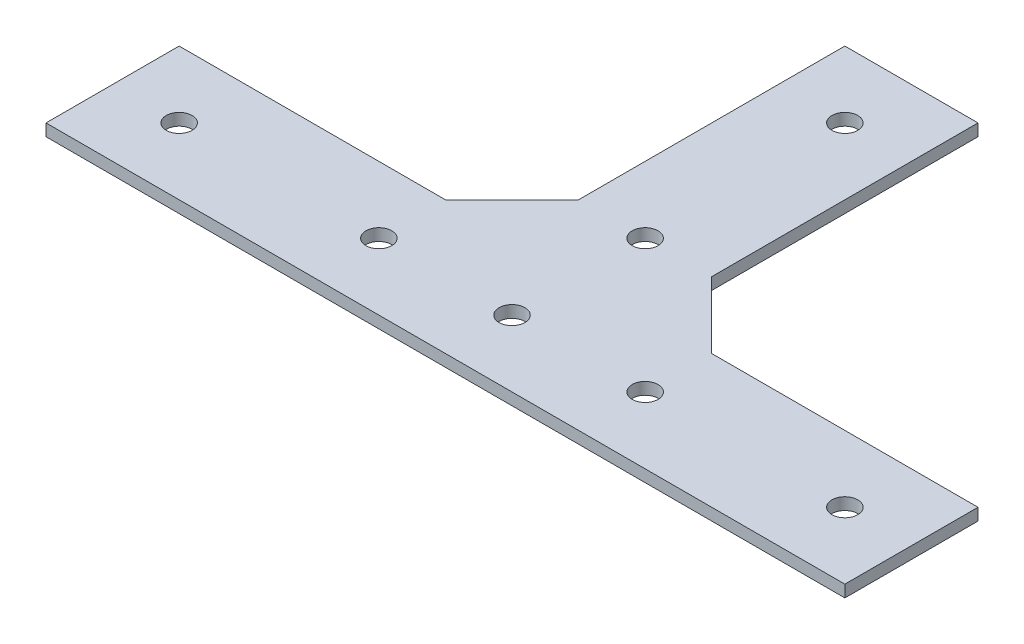
ISO-10303-21;
HEADER;
FILE_DESCRIPTION(('STEP AP214'),'2;1');
FILE_NAME('part.step','',(''),(''),'','','');
FILE_SCHEMA(('AUTOMOTIVE_DESIGN { 1 0 10303 214 1 1 1 1 }'));
ENDSEC;
DATA;
#1=APPLICATION_CONTEXT('core data for automotive mechanical design processes');
#2=APPLICATION_PROTOCOL_DEFINITION('international standard','automotive_design',2000,#1);
#3=PRODUCT_CONTEXT('',#1,'mechanical');
#4=PRODUCT('Part','Part','',(#3));
#5=PRODUCT_RELATED_PRODUCT_CATEGORY('part','',(#4));
#6=PRODUCT_DEFINITION_FORMATION('','',#4);
#7=PRODUCT_DEFINITION_CONTEXT('part definition',#1,'design');
#8=PRODUCT_DEFINITION('design','',#6,#7);
#9=PRODUCT_DEFINITION_SHAPE('','',#8);
#10=(LENGTH_UNIT() NAMED_UNIT(*) SI_UNIT(.MILLI.,.METRE.));
#11=(NAMED_UNIT(*) PLANE_ANGLE_UNIT() SI_UNIT($,.RADIAN.));
#12=(NAMED_UNIT(*) SI_UNIT($,.STERADIAN.) SOLID_ANGLE_UNIT());
#13=UNCERTAINTY_MEASURE_WITH_UNIT(LENGTH_MEASURE(1.E-05),#10,'distance_accuracy_value','');
#14=(GEOMETRIC_REPRESENTATION_CONTEXT(3) GLOBAL_UNCERTAINTY_ASSIGNED_CONTEXT((#13)) GLOBAL_UNIT_ASSIGNED_CONTEXT((#10,
#11,#12)) REPRESENTATION_CONTEXT('',''));
#15=CARTESIAN_POINT('',(0.,0.,0.));
#16=DIRECTION('',(0.,0.,1.));
#17=DIRECTION('',(1.,0.,0.));
#18=AXIS2_PLACEMENT_3D('',#15,#16,#17);
#19=CARTESIAN_POINT('',(0.,2.286,0.));
#20=DIRECTION('',(0.,1.,0.));
#21=DIRECTION('',(0.,0.,1.));
#22=AXIS2_PLACEMENT_3D('',#19,#20,#21);
#23=PLANE('',#22);
#24=DIRECTION('',(-0.707106781186548,0.,-0.707106781186548));
#25=VECTOR('',#24,1.);
#26=CARTESIAN_POINT('',(25.4,2.286,-38.1));
#27=LINE('',#26,#25);
#28=CARTESIAN_POINT('',(38.1,2.286,-25.4));
#29=VERTEX_POINT('',#28);
#30=CARTESIAN_POINT('',(25.4,2.286,-38.1));
#31=VERTEX_POINT('',#30);
#32=EDGE_CURVE('E157',#29,#31,#27,.T.);
#33=ORIENTED_EDGE('',*,*,#32,.T.);
#34=DIRECTION('',(0.,0.,-1.));
#35=VECTOR('',#34,1.);
#36=CARTESIAN_POINT('',(25.4,2.286,-38.1));
#37=LINE('',#36,#35);
#38=CARTESIAN_POINT('',(25.4,2.286,-88.9));
#39=VERTEX_POINT('',#38);
#40=EDGE_CURVE('E159',#31,#39,#37,.T.);
#41=ORIENTED_EDGE('',*,*,#40,.T.);
#42=DIRECTION('',(-1.,0.,0.));
#43=VECTOR('',#42,1.);
#44=CARTESIAN_POINT('',(0.,2.286,-88.9));
#45=LINE('',#44,#43);
#46=CARTESIAN_POINT('',(0.,2.286,-88.9));
#47=VERTEX_POINT('',#46);
#48=EDGE_CURVE('E161',#39,#47,#45,.T.);
#49=ORIENTED_EDGE('',*,*,#48,.T.);
#50=DIRECTION('',(0.,0.,1.));
#51=VECTOR('',#50,1.);
#52=CARTESIAN_POINT('',(0.,2.286,-88.9));
#53=LINE('',#52,#51);
#54=CARTESIAN_POINT('',(0.,2.286,-38.1));
#55=VERTEX_POINT('',#54);
#56=EDGE_CURVE('E129',#47,#55,#53,.T.);
#57=ORIENTED_EDGE('',*,*,#56,.T.);
#58=DIRECTION('',(0.707106781186548,0.,-0.707106781186548));
#59=VECTOR('',#58,1.);
#60=CARTESIAN_POINT('',(0.,2.286,-38.1));
#61=LINE('',#60,#59);
#62=CARTESIAN_POINT('',(-12.7,2.286,-25.4));
#63=VERTEX_POINT('',#62);
#64=EDGE_CURVE('E114',#63,#55,#61,.T.);
#65=ORIENTED_EDGE('',*,*,#64,.F.);
#66=DIRECTION('',(1.,0.,0.));
#67=VECTOR('',#66,1.);
#68=CARTESIAN_POINT('',(-12.7,2.286,-25.4));
#69=LINE('',#68,#67);
#70=CARTESIAN_POINT('',(-63.5,2.286,-25.4));
#71=VERTEX_POINT('',#70);
#72=EDGE_CURVE('E127',#71,#63,#69,.T.);
#73=ORIENTED_EDGE('',*,*,#72,.F.);
#74=DIRECTION('',(0.,0.,-1.));
#75=VECTOR('',#74,1.);
#76=CARTESIAN_POINT('',(-63.5,2.286,0.));
#77=LINE('',#76,#75);
#78=CARTESIAN_POINT('',(-63.5,2.286,0.));
#79=VERTEX_POINT('',#78);
#80=EDGE_CURVE('E133',#79,#71,#77,.T.);
#81=ORIENTED_EDGE('',*,*,#80,.F.);
#82=DIRECTION('',(1.,0.,0.));
#83=VECTOR('',#82,1.);
#84=CARTESIAN_POINT('',(0.,2.286,0.));
#85=LINE('',#84,#83);
#86=CARTESIAN_POINT('',(88.9,2.286,0.));
#87=VERTEX_POINT('',#86);
#88=EDGE_CURVE('E150',#79,#87,#85,.T.);
#89=ORIENTED_EDGE('',*,*,#88,.T.);
#90=DIRECTION('',(0.,0.,-1.));
#91=VECTOR('',#90,1.);
#92=CARTESIAN_POINT('',(88.9,2.286,0.));
#93=LINE('',#92,#91);
#94=CARTESIAN_POINT('',(88.9,2.286,-25.4));
#95=VERTEX_POINT('',#94);
#96=EDGE_CURVE('E153',#87,#95,#93,.T.);
#97=ORIENTED_EDGE('',*,*,#96,.T.);
#98=DIRECTION('',(-1.,0.,0.));
#99=VECTOR('',#98,1.);
#100=CARTESIAN_POINT('',(38.1,2.286,-25.4));
#101=LINE('',#100,#99);
#102=EDGE_CURVE('E155',#95,#29,#101,.T.);
#103=ORIENTED_EDGE('',*,*,#102,.T.);
#104=EDGE_LOOP('',(#33,#41,#49,#57,#65,#73,#81,#89,#97,#103));
#105=FACE_BOUND('',#104,.T.);
#106=CARTESIAN_POINT('',(76.2,2.286,-12.7));
#107=DIRECTION('',(0.,1.,0.));
#108=DIRECTION('',(0.,0.,1.));
#109=AXIS2_PLACEMENT_3D('',#106,#107,#108);
#110=CIRCLE('',#109,2.4638);
#111=CARTESIAN_POINT('',(76.2,2.286,-10.2362));
#112=VERTEX_POINT('',#111);
#113=EDGE_CURVE('E327',#112,#112,#110,.T.);
#114=ORIENTED_EDGE('',*,*,#113,.F.);
#115=EDGE_LOOP('',(#114));
#116=FACE_BOUND('',#115,.T.);
#117=CARTESIAN_POINT('',(12.7,2.286,-12.7));
#118=DIRECTION('',(0.,1.,0.));
#119=DIRECTION('',(0.,0.,1.));
#120=AXIS2_PLACEMENT_3D('',#117,#118,#119);
#121=CIRCLE('',#120,2.4638);
#122=CARTESIAN_POINT('',(12.7,2.286,-10.2362));
#123=VERTEX_POINT('',#122);
#124=EDGE_CURVE('E319',#123,#123,#121,.T.);
#125=ORIENTED_EDGE('',*,*,#124,.F.);
#126=EDGE_LOOP('',(#125));
#127=FACE_BOUND('',#126,.T.);
#128=CARTESIAN_POINT('',(12.7,2.286,-76.2));
#129=DIRECTION('',(0.,1.,0.));
#130=DIRECTION('',(0.,0.,1.));
#131=AXIS2_PLACEMENT_3D('',#128,#129,#130);
#132=CIRCLE('',#131,2.4638);
#133=CARTESIAN_POINT('',(12.7,2.286,-73.7362));
#134=VERTEX_POINT('',#133);
#135=EDGE_CURVE('E315',#134,#134,#132,.T.);
#136=ORIENTED_EDGE('',*,*,#135,.F.);
#137=EDGE_LOOP('',(#136));
#138=FACE_BOUND('',#137,.T.);
#139=CARTESIAN_POINT('',(12.7,2.286,-38.1));
#140=DIRECTION('',(0.,1.,0.));
#141=DIRECTION('',(0.,0.,1.));
#142=AXIS2_PLACEMENT_3D('',#139,#140,#141);
#143=CIRCLE('',#142,2.4638);
#144=CARTESIAN_POINT('',(12.7,2.286,-35.6362));
#145=VERTEX_POINT('',#144);
#146=EDGE_CURVE('E322',#145,#145,#143,.T.);
#147=ORIENTED_EDGE('',*,*,#146,.F.);
#148=EDGE_LOOP('',(#147));
#149=FACE_BOUND('',#148,.T.);
#150=CARTESIAN_POINT('',(38.1,2.286,-12.7));
#151=DIRECTION('',(0.,1.,0.));
#152=DIRECTION('',(0.,0.,1.));
#153=AXIS2_PLACEMENT_3D('',#150,#151,#152);
#154=CIRCLE('',#153,2.4638);
#155=CARTESIAN_POINT('',(38.1,2.286,-10.2362));
#156=VERTEX_POINT('',#155);
#157=EDGE_CURVE('E338',#156,#156,#154,.T.);
#158=ORIENTED_EDGE('',*,*,#157,.F.);
#159=EDGE_LOOP('',(#158));
#160=FACE_BOUND('',#159,.T.);
#161=CARTESIAN_POINT('',(-50.8,2.286,-12.7));
#162=DIRECTION('',(0.,-1.,0.));
#163=DIRECTION('',(0.,0.,1.));
#164=AXIS2_PLACEMENT_3D('',#161,#162,#163);
#165=CIRCLE('',#164,2.4638);
#166=CARTESIAN_POINT('',(-50.8,2.286,-10.2362));
#167=VERTEX_POINT('',#166);
#168=EDGE_CURVE('E347',#167,#167,#165,.T.);
#169=ORIENTED_EDGE('',*,*,#168,.T.);
#170=EDGE_LOOP('',(#169));
#171=FACE_BOUND('',#170,.T.);
#172=CARTESIAN_POINT('',(-12.7,2.286,-12.7));
#173=DIRECTION('',(0.,-1.,0.));
#174=DIRECTION('',(0.,0.,1.));
#175=AXIS2_PLACEMENT_3D('',#172,#173,#174);
#176=CIRCLE('',#175,2.4638);
#177=CARTESIAN_POINT('',(-12.7,2.286,-10.2362));
#178=VERTEX_POINT('',#177);
#179=EDGE_CURVE('E353',#178,#178,#176,.T.);
#180=ORIENTED_EDGE('',*,*,#179,.T.);
#181=EDGE_LOOP('',(#180));
#182=FACE_BOUND('',#181,.T.);
#183=ADVANCED_FACE('F34',(#105,#116,#127,#138,#149,#160,#171,#182),#23,.T.);
#184=CARTESIAN_POINT('',(0.,0.,0.));
#185=DIRECTION('',(0.,1.,0.));
#186=DIRECTION('',(0.,0.,1.));
#187=AXIS2_PLACEMENT_3D('',#184,#185,#186);
#188=PLANE('',#187);
#189=CARTESIAN_POINT('',(-50.8,0.,-12.7));
#190=DIRECTION('',(0.,-1.,0.));
#191=DIRECTION('',(0.,0.,1.));
#192=AXIS2_PLACEMENT_3D('',#189,#190,#191);
#193=CIRCLE('',#192,2.4638);
#194=CARTESIAN_POINT('',(-50.8,0.,-10.2362));
#195=VERTEX_POINT('',#194);
#196=EDGE_CURVE('E342',#195,#195,#193,.T.);
#197=ORIENTED_EDGE('',*,*,#196,.F.);
#198=EDGE_LOOP('',(#197));
#199=FACE_BOUND('',#198,.T.);
#200=CARTESIAN_POINT('',(38.1,0.,-12.7));
#201=DIRECTION('',(0.,1.,0.));
#202=DIRECTION('',(0.,0.,1.));
#203=AXIS2_PLACEMENT_3D('',#200,#201,#202);
#204=CIRCLE('',#203,2.4638);
#205=CARTESIAN_POINT('',(38.1,0.,-10.2362));
#206=VERTEX_POINT('',#205);
#207=EDGE_CURVE('E341',#206,#206,#204,.T.);
#208=ORIENTED_EDGE('',*,*,#207,.T.);
#209=EDGE_LOOP('',(#208));
#210=FACE_BOUND('',#209,.T.);
#211=CARTESIAN_POINT('',(12.7,0.,-38.1));
#212=DIRECTION('',(0.,1.,0.));
#213=DIRECTION('',(0.,0.,1.));
#214=AXIS2_PLACEMENT_3D('',#211,#212,#213);
#215=CIRCLE('',#214,2.4638);
#216=CARTESIAN_POINT('',(12.7,0.,-35.6362));
#217=VERTEX_POINT('',#216);
#218=EDGE_CURVE('E317',#217,#217,#215,.T.);
#219=ORIENTED_EDGE('',*,*,#218,.T.);
#220=EDGE_LOOP('',(#219));
#221=FACE_BOUND('',#220,.T.);
#222=CARTESIAN_POINT('',(12.7,0.,-76.2));
#223=DIRECTION('',(0.,1.,0.));
#224=DIRECTION('',(0.,0.,1.));
#225=AXIS2_PLACEMENT_3D('',#222,#223,#224);
#226=CIRCLE('',#225,2.4638);
#227=CARTESIAN_POINT('',(12.7,0.,-73.7362));
#228=VERTEX_POINT('',#227);
#229=EDGE_CURVE('E312',#228,#228,#226,.T.);
#230=ORIENTED_EDGE('',*,*,#229,.T.);
#231=EDGE_LOOP('',(#230));
#232=FACE_BOUND('',#231,.T.);
#233=CARTESIAN_POINT('',(12.7,0.,-12.7));
#234=DIRECTION('',(0.,1.,0.));
#235=DIRECTION('',(0.,0.,1.));
#236=AXIS2_PLACEMENT_3D('',#233,#234,#235);
#237=CIRCLE('',#236,2.4638);
#238=CARTESIAN_POINT('',(12.7,0.,-10.2362));
#239=VERTEX_POINT('',#238);
#240=EDGE_CURVE('E329',#239,#239,#237,.T.);
#241=ORIENTED_EDGE('',*,*,#240,.T.);
#242=EDGE_LOOP('',(#241));
#243=FACE_BOUND('',#242,.T.);
#244=CARTESIAN_POINT('',(76.2,0.,-12.7));
#245=DIRECTION('',(0.,1.,0.));
#246=DIRECTION('',(0.,0.,1.));
#247=AXIS2_PLACEMENT_3D('',#244,#245,#246);
#248=CIRCLE('',#247,2.4638);
#249=CARTESIAN_POINT('',(76.2,0.,-10.2362));
#250=VERTEX_POINT('',#249);
#251=EDGE_CURVE('E141',#250,#250,#248,.T.);
#252=ORIENTED_EDGE('',*,*,#251,.T.);
#253=EDGE_LOOP('',(#252));
#254=FACE_BOUND('',#253,.T.);
#255=DIRECTION('',(0.,0.,-1.));
#256=VECTOR('',#255,1.);
#257=CARTESIAN_POINT('',(88.9,0.,0.));
#258=LINE('',#257,#256);
#259=CARTESIAN_POINT('',(88.9,0.,0.));
#260=VERTEX_POINT('',#259);
#261=CARTESIAN_POINT('',(88.9,0.,-25.4));
#262=VERTEX_POINT('',#261);
#263=EDGE_CURVE('E167',#260,#262,#258,.T.);
#264=ORIENTED_EDGE('',*,*,#263,.F.);
#265=DIRECTION('',(1.,0.,0.));
#266=VECTOR('',#265,1.);
#267=CARTESIAN_POINT('',(0.,0.,0.));
#268=LINE('',#267,#266);
#269=CARTESIAN_POINT('',(-63.5,0.,0.));
#270=VERTEX_POINT('',#269);
#271=EDGE_CURVE('E165',#270,#260,#268,.T.);
#272=ORIENTED_EDGE('',*,*,#271,.F.);
#273=DIRECTION('',(0.,0.,-1.));
#274=VECTOR('',#273,1.);
#275=CARTESIAN_POINT('',(-63.5,0.,0.));
#276=LINE('',#275,#274);
#277=CARTESIAN_POINT('',(-63.5,0.,-25.4));
#278=VERTEX_POINT('',#277);
#279=EDGE_CURVE('E130',#270,#278,#276,.T.);
#280=ORIENTED_EDGE('',*,*,#279,.T.);
#281=DIRECTION('',(1.,0.,0.));
#282=VECTOR('',#281,1.);
#283=CARTESIAN_POINT('',(-12.7,0.,-25.4));
#284=LINE('',#283,#282);
#285=CARTESIAN_POINT('',(-12.7,0.,-25.4));
#286=VERTEX_POINT('',#285);
#287=EDGE_CURVE('E140',#278,#286,#284,.T.);
#288=ORIENTED_EDGE('',*,*,#287,.T.);
#289=DIRECTION('',(0.707106781186548,0.,-0.707106781186548));
#290=VECTOR('',#289,1.);
#291=CARTESIAN_POINT('',(0.,0.,-38.1));
#292=LINE('',#291,#290);
#293=CARTESIAN_POINT('',(0.,0.,-38.1));
#294=VERTEX_POINT('',#293);
#295=EDGE_CURVE('E116',#286,#294,#292,.T.);
#296=ORIENTED_EDGE('',*,*,#295,.T.);
#297=DIRECTION('',(0.,0.,1.));
#298=VECTOR('',#297,1.);
#299=CARTESIAN_POINT('',(0.,0.,-88.9));
#300=LINE('',#299,#298);
#301=CARTESIAN_POINT('',(0.,0.,-88.9));
#302=VERTEX_POINT('',#301);
#303=EDGE_CURVE('E54',#302,#294,#300,.T.);
#304=ORIENTED_EDGE('',*,*,#303,.F.);
#305=DIRECTION('',(-1.,0.,0.));
#306=VECTOR('',#305,1.);
#307=CARTESIAN_POINT('',(0.,0.,-88.9));
#308=LINE('',#307,#306);
#309=CARTESIAN_POINT('',(25.4,0.,-88.9));
#310=VERTEX_POINT('',#309);
#311=EDGE_CURVE('E151',#310,#302,#308,.T.);
#312=ORIENTED_EDGE('',*,*,#311,.F.);
#313=DIRECTION('',(0.,0.,-1.));
#314=VECTOR('',#313,1.);
#315=CARTESIAN_POINT('',(25.4,0.,-38.1));
#316=LINE('',#315,#314);
#317=CARTESIAN_POINT('',(25.4,0.,-38.1));
#318=VERTEX_POINT('',#317);
#319=EDGE_CURVE('E173',#318,#310,#316,.T.);
#320=ORIENTED_EDGE('',*,*,#319,.F.);
#321=DIRECTION('',(-0.707106781186548,0.,-0.707106781186548));
#322=VECTOR('',#321,1.);
#323=CARTESIAN_POINT('',(25.4,0.,-38.1));
#324=LINE('',#323,#322);
#325=CARTESIAN_POINT('',(38.1,0.,-25.4));
#326=VERTEX_POINT('',#325);
#327=EDGE_CURVE('E171',#326,#318,#324,.T.);
#328=ORIENTED_EDGE('',*,*,#327,.F.);
#329=DIRECTION('',(-1.,0.,0.));
#330=VECTOR('',#329,1.);
#331=CARTESIAN_POINT('',(38.1,0.,-25.4));
#332=LINE('',#331,#330);
#333=EDGE_CURVE('E169',#262,#326,#332,.T.);
#334=ORIENTED_EDGE('',*,*,#333,.F.);
#335=EDGE_LOOP('',(#264,#272,#280,#288,#296,#304,#312,#320,#328,#334));
#336=FACE_BOUND('',#335,.T.);
#337=CARTESIAN_POINT('',(-12.7,0.,-12.7));
#338=DIRECTION('',(0.,-1.,0.));
#339=DIRECTION('',(0.,0.,1.));
#340=AXIS2_PLACEMENT_3D('',#337,#338,#339);
#341=CIRCLE('',#340,2.4638);
#342=CARTESIAN_POINT('',(-12.7,0.,-10.2362));
#343=VERTEX_POINT('',#342);
#344=EDGE_CURVE('E350',#343,#343,#341,.T.);
#345=ORIENTED_EDGE('',*,*,#344,.F.);
#346=EDGE_LOOP('',(#345));
#347=FACE_BOUND('',#346,.T.);
#348=ADVANCED_FACE('F197',(#199,#210,#221,#232,#243,#254,#336,#347),#188,.F.);
#349=CARTESIAN_POINT('',(0.,2.286,-88.9));
#350=DIRECTION('',(1.,0.,0.));
#351=DIRECTION('',(0.,0.,-1.));
#352=AXIS2_PLACEMENT_3D('',#349,#350,#351);
#353=PLANE('',#352);
#354=ORIENTED_EDGE('',*,*,#303,.T.);
#355=DIRECTION('',(0.,-1.,0.));
#356=VECTOR('',#355,1.);
#357=CARTESIAN_POINT('',(0.,2.286,-38.1));
#358=LINE('',#357,#356);
#359=EDGE_CURVE('E49',#55,#294,#358,.T.);
#360=ORIENTED_EDGE('',*,*,#359,.F.);
#361=ORIENTED_EDGE('',*,*,#56,.F.);
#362=DIRECTION('',(0.,-1.,0.));
#363=VECTOR('',#362,1.);
#364=CARTESIAN_POINT('',(0.,2.286,-88.9));
#365=LINE('',#364,#363);
#366=EDGE_CURVE('E163',#47,#302,#365,.T.);
#367=ORIENTED_EDGE('',*,*,#366,.T.);
#368=EDGE_LOOP('',(#354,#360,#361,#367));
#369=FACE_BOUND('',#368,.T.);
#370=ADVANCED_FACE('F36',(#369),#353,.F.);
#371=CARTESIAN_POINT('',(0.,2.286,0.));
#372=DIRECTION('',(0.,0.,-1.));
#373=DIRECTION('',(-1.,0.,0.));
#374=AXIS2_PLACEMENT_3D('',#371,#372,#373);
#375=PLANE('',#374);
#376=DIRECTION('',(0.,-1.,0.));
#377=VECTOR('',#376,1.);
#378=CARTESIAN_POINT('',(88.9,2.286,0.));
#379=LINE('',#378,#377);
#380=EDGE_CURVE('E11',#87,#260,#379,.T.);
#381=ORIENTED_EDGE('',*,*,#380,.F.);
#382=ORIENTED_EDGE('',*,*,#88,.F.);
#383=DIRECTION('',(0.,-1.,0.));
#384=VECTOR('',#383,1.);
#385=CARTESIAN_POINT('',(-63.5,2.286,0.));
#386=LINE('',#385,#384);
#387=EDGE_CURVE('E135',#79,#270,#386,.T.);
#388=ORIENTED_EDGE('',*,*,#387,.T.);
#389=ORIENTED_EDGE('',*,*,#271,.T.);
#390=EDGE_LOOP('',(#381,#382,#388,#389));
#391=FACE_BOUND('',#390,.T.);
#392=ADVANCED_FACE('F214',(#391),#375,.F.);
#393=CARTESIAN_POINT('',(88.9,2.286,0.));
#394=DIRECTION('',(-1.,0.,0.));
#395=DIRECTION('',(0.,0.,1.));
#396=AXIS2_PLACEMENT_3D('',#393,#394,#395);
#397=PLANE('',#396);
#398=ORIENTED_EDGE('',*,*,#263,.T.);
#399=DIRECTION('',(0.,-1.,0.));
#400=VECTOR('',#399,1.);
#401=CARTESIAN_POINT('',(88.9,2.286,-25.4));
#402=LINE('',#401,#400);
#403=EDGE_CURVE('E42',#95,#262,#402,.T.);
#404=ORIENTED_EDGE('',*,*,#403,.F.);
#405=ORIENTED_EDGE('',*,*,#96,.F.);
#406=ORIENTED_EDGE('',*,*,#380,.T.);
#407=EDGE_LOOP('',(#398,#404,#405,#406));
#408=FACE_BOUND('',#407,.T.);
#409=ADVANCED_FACE('F212',(#408),#397,.F.);
#410=CARTESIAN_POINT('',(38.1,2.286,-25.4));
#411=DIRECTION('',(0.,0.,1.));
#412=DIRECTION('',(1.,0.,0.));
#413=AXIS2_PLACEMENT_3D('',#410,#411,#412);
#414=PLANE('',#413);
#415=ORIENTED_EDGE('',*,*,#333,.T.);
#416=DIRECTION('',(0.,-1.,0.));
#417=VECTOR('',#416,1.);
#418=CARTESIAN_POINT('',(38.1,2.286,-25.4));
#419=LINE('',#418,#417);
#420=EDGE_CURVE('E183',#29,#326,#419,.T.);
#421=ORIENTED_EDGE('',*,*,#420,.F.);
#422=ORIENTED_EDGE('',*,*,#102,.F.);
#423=ORIENTED_EDGE('',*,*,#403,.T.);
#424=EDGE_LOOP('',(#415,#421,#422,#423));
#425=FACE_BOUND('',#424,.T.);
#426=ADVANCED_FACE('F190',(#425),#414,.F.);
#427=CARTESIAN_POINT('',(25.4,2.286,-38.1));
#428=DIRECTION('',(-0.707106781186548,0.,0.707106781186548));
#429=DIRECTION('',(0.707106781186548,0.,0.707106781186548));
#430=AXIS2_PLACEMENT_3D('',#427,#428,#429);
#431=PLANE('',#430);
#432=ORIENTED_EDGE('',*,*,#327,.T.);
#433=DIRECTION('',(0.,-1.,0.));
#434=VECTOR('',#433,1.);
#435=CARTESIAN_POINT('',(25.4,2.286,-38.1));
#436=LINE('',#435,#434);
#437=EDGE_CURVE('E180',#31,#318,#436,.T.);
#438=ORIENTED_EDGE('',*,*,#437,.F.);
#439=ORIENTED_EDGE('',*,*,#32,.F.);
#440=ORIENTED_EDGE('',*,*,#420,.T.);
#441=EDGE_LOOP('',(#432,#438,#439,#440));
#442=FACE_BOUND('',#441,.T.);
#443=ADVANCED_FACE('F203',(#442),#431,.F.);
#444=CARTESIAN_POINT('',(25.4,2.286,-38.1));
#445=DIRECTION('',(-1.,0.,0.));
#446=DIRECTION('',(0.,0.,1.));
#447=AXIS2_PLACEMENT_3D('',#444,#445,#446);
#448=PLANE('',#447);
#449=ORIENTED_EDGE('',*,*,#319,.T.);
#450=DIRECTION('',(0.,-1.,0.));
#451=VECTOR('',#450,1.);
#452=CARTESIAN_POINT('',(25.4,2.286,-88.9));
#453=LINE('',#452,#451);
#454=EDGE_CURVE('E177',#39,#310,#453,.T.);
#455=ORIENTED_EDGE('',*,*,#454,.F.);
#456=ORIENTED_EDGE('',*,*,#40,.F.);
#457=ORIENTED_EDGE('',*,*,#437,.T.);
#458=EDGE_LOOP('',(#449,#455,#456,#457));
#459=FACE_BOUND('',#458,.T.);
#460=ADVANCED_FACE('F207',(#459),#448,.F.);
#461=CARTESIAN_POINT('',(0.,2.286,-88.9));
#462=DIRECTION('',(0.,0.,1.));
#463=DIRECTION('',(1.,0.,0.));
#464=AXIS2_PLACEMENT_3D('',#461,#462,#463);
#465=PLANE('',#464);
#466=ORIENTED_EDGE('',*,*,#311,.T.);
#467=ORIENTED_EDGE('',*,*,#366,.F.);
#468=ORIENTED_EDGE('',*,*,#48,.F.);
#469=ORIENTED_EDGE('',*,*,#454,.T.);
#470=EDGE_LOOP('',(#466,#467,#468,#469));
#471=FACE_BOUND('',#470,.T.);
#472=ADVANCED_FACE('F239',(#471),#465,.F.);
#473=CARTESIAN_POINT('',(0.,2.286,-38.1));
#474=DIRECTION('',(-0.707106781186548,0.,-0.707106781186548));
#475=DIRECTION('',(-0.707106781186548,0.,0.707106781186548));
#476=AXIS2_PLACEMENT_3D('',#473,#474,#475);
#477=PLANE('',#476);
#478=ORIENTED_EDGE('',*,*,#295,.F.);
#479=DIRECTION('',(0.,-1.,0.));
#480=VECTOR('',#479,1.);
#481=CARTESIAN_POINT('',(-12.7,2.286,-25.4));
#482=LINE('',#481,#480);
#483=EDGE_CURVE('E111',#63,#286,#482,.T.);
#484=ORIENTED_EDGE('',*,*,#483,.F.);
#485=ORIENTED_EDGE('',*,*,#64,.T.);
#486=ORIENTED_EDGE('',*,*,#359,.T.);
#487=EDGE_LOOP('',(#478,#484,#485,#486));
#488=FACE_BOUND('',#487,.T.);
#489=ADVANCED_FACE('F113',(#488),#477,.T.);
#490=CARTESIAN_POINT('',(-12.7,2.286,-25.4));
#491=DIRECTION('',(0.,0.,-1.));
#492=DIRECTION('',(-1.,0.,0.));
#493=AXIS2_PLACEMENT_3D('',#490,#491,#492);
#494=PLANE('',#493);
#495=ORIENTED_EDGE('',*,*,#287,.F.);
#496=DIRECTION('',(0.,-1.,0.));
#497=VECTOR('',#496,1.);
#498=CARTESIAN_POINT('',(-63.5,2.286,-25.4));
#499=LINE('',#498,#497);
#500=EDGE_CURVE('E121',#71,#278,#499,.T.);
#501=ORIENTED_EDGE('',*,*,#500,.F.);
#502=ORIENTED_EDGE('',*,*,#72,.T.);
#503=ORIENTED_EDGE('',*,*,#483,.T.);
#504=EDGE_LOOP('',(#495,#501,#502,#503));
#505=FACE_BOUND('',#504,.T.);
#506=ADVANCED_FACE('F132',(#505),#494,.T.);
#507=CARTESIAN_POINT('',(-63.5,2.286,0.));
#508=DIRECTION('',(-1.,0.,0.));
#509=DIRECTION('',(0.,0.,1.));
#510=AXIS2_PLACEMENT_3D('',#507,#508,#509);
#511=PLANE('',#510);
#512=ORIENTED_EDGE('',*,*,#279,.F.);
#513=ORIENTED_EDGE('',*,*,#387,.F.);
#514=ORIENTED_EDGE('',*,*,#80,.T.);
#515=ORIENTED_EDGE('',*,*,#500,.T.);
#516=EDGE_LOOP('',(#512,#513,#514,#515));
#517=FACE_BOUND('',#516,.T.);
#518=ADVANCED_FACE('F218',(#517),#511,.T.);
#519=CARTESIAN_POINT('',(76.2,0.,-12.7));
#520=DIRECTION('',(0.,1.,0.));
#521=DIRECTION('',(0.,0.,1.));
#522=AXIS2_PLACEMENT_3D('',#519,#520,#521);
#523=CYLINDRICAL_SURFACE('',#522,2.4638);
#524=ORIENTED_EDGE('',*,*,#251,.F.);
#525=EDGE_LOOP('',(#524));
#526=FACE_BOUND('',#525,.T.);
#527=ORIENTED_EDGE('',*,*,#113,.T.);
#528=EDGE_LOOP('',(#527));
#529=FACE_BOUND('',#528,.T.);
#530=ADVANCED_FACE('F220',(#526,#529),#523,.F.);
#531=CARTESIAN_POINT('',(12.7,0.,-12.7));
#532=DIRECTION('',(0.,1.,0.));
#533=DIRECTION('',(0.,0.,1.));
#534=AXIS2_PLACEMENT_3D('',#531,#532,#533);
#535=CYLINDRICAL_SURFACE('',#534,2.4638);
#536=ORIENTED_EDGE('',*,*,#240,.F.);
#537=EDGE_LOOP('',(#536));
#538=FACE_BOUND('',#537,.T.);
#539=ORIENTED_EDGE('',*,*,#124,.T.);
#540=EDGE_LOOP('',(#539));
#541=FACE_BOUND('',#540,.T.);
#542=ADVANCED_FACE('F226',(#538,#541),#535,.F.);
#543=CARTESIAN_POINT('',(12.7,0.,-76.2));
#544=DIRECTION('',(0.,1.,0.));
#545=DIRECTION('',(0.,0.,1.));
#546=AXIS2_PLACEMENT_3D('',#543,#544,#545);
#547=CYLINDRICAL_SURFACE('',#546,2.4638);
#548=ORIENTED_EDGE('',*,*,#229,.F.);
#549=EDGE_LOOP('',(#548));
#550=FACE_BOUND('',#549,.T.);
#551=ORIENTED_EDGE('',*,*,#135,.T.);
#552=EDGE_LOOP('',(#551));
#553=FACE_BOUND('',#552,.T.);
#554=ADVANCED_FACE('F298',(#550,#553),#547,.F.);
#555=CARTESIAN_POINT('',(12.7,0.,-38.1));
#556=DIRECTION('',(0.,1.,0.));
#557=DIRECTION('',(0.,0.,1.));
#558=AXIS2_PLACEMENT_3D('',#555,#556,#557);
#559=CYLINDRICAL_SURFACE('',#558,2.4638);
#560=ORIENTED_EDGE('',*,*,#218,.F.);
#561=EDGE_LOOP('',(#560));
#562=FACE_BOUND('',#561,.T.);
#563=ORIENTED_EDGE('',*,*,#146,.T.);
#564=EDGE_LOOP('',(#563));
#565=FACE_BOUND('',#564,.T.);
#566=ADVANCED_FACE('F295',(#562,#565),#559,.F.);
#567=CARTESIAN_POINT('',(38.1,0.,-12.7));
#568=DIRECTION('',(0.,1.,0.));
#569=DIRECTION('',(0.,0.,1.));
#570=AXIS2_PLACEMENT_3D('',#567,#568,#569);
#571=CYLINDRICAL_SURFACE('',#570,2.4638);
#572=ORIENTED_EDGE('',*,*,#207,.F.);
#573=EDGE_LOOP('',(#572));
#574=FACE_BOUND('',#573,.T.);
#575=ORIENTED_EDGE('',*,*,#157,.T.);
#576=EDGE_LOOP('',(#575));
#577=FACE_BOUND('',#576,.T.);
#578=ADVANCED_FACE('F277',(#574,#577),#571,.F.);
#579=CARTESIAN_POINT('',(-50.8,0.,-12.7));
#580=DIRECTION('',(0.,1.,0.));
#581=DIRECTION('',(0.,0.,1.));
#582=AXIS2_PLACEMENT_3D('',#579,#580,#581);
#583=CYLINDRICAL_SURFACE('',#582,2.4638);
#584=ORIENTED_EDGE('',*,*,#196,.T.);
#585=EDGE_LOOP('',(#584));
#586=FACE_BOUND('',#585,.T.);
#587=ORIENTED_EDGE('',*,*,#168,.F.);
#588=EDGE_LOOP('',(#587));
#589=FACE_BOUND('',#588,.T.);
#590=ADVANCED_FACE('F271',(#586,#589),#583,.F.);
#591=CARTESIAN_POINT('',(-12.7,0.,-12.7));
#592=DIRECTION('',(0.,1.,0.));
#593=DIRECTION('',(0.,0.,1.));
#594=AXIS2_PLACEMENT_3D('',#591,#592,#593);
#595=CYLINDRICAL_SURFACE('',#594,2.4638);
#596=ORIENTED_EDGE('',*,*,#344,.T.);
#597=EDGE_LOOP('',(#596));
#598=FACE_BOUND('',#597,.T.);
#599=ORIENTED_EDGE('',*,*,#179,.F.);
#600=EDGE_LOOP('',(#599));
#601=FACE_BOUND('',#600,.T.);
#602=ADVANCED_FACE('F276',(#598,#601),#595,.F.);
#603=CLOSED_SHELL('',(#183,#348,#370,#392,#409,#426,#443,#460,#472,#489,#506,#518,#530,#542,
#554,#566,#578,#590,#602));
#604=MANIFOLD_SOLID_BREP('B2',#603);
#605=ADVANCED_BREP_SHAPE_REPRESENTATION('',(#18,#604),#14);
#606=SHAPE_DEFINITION_REPRESENTATION(#9,#605);
ENDSEC;
END-ISO-10303-21;
